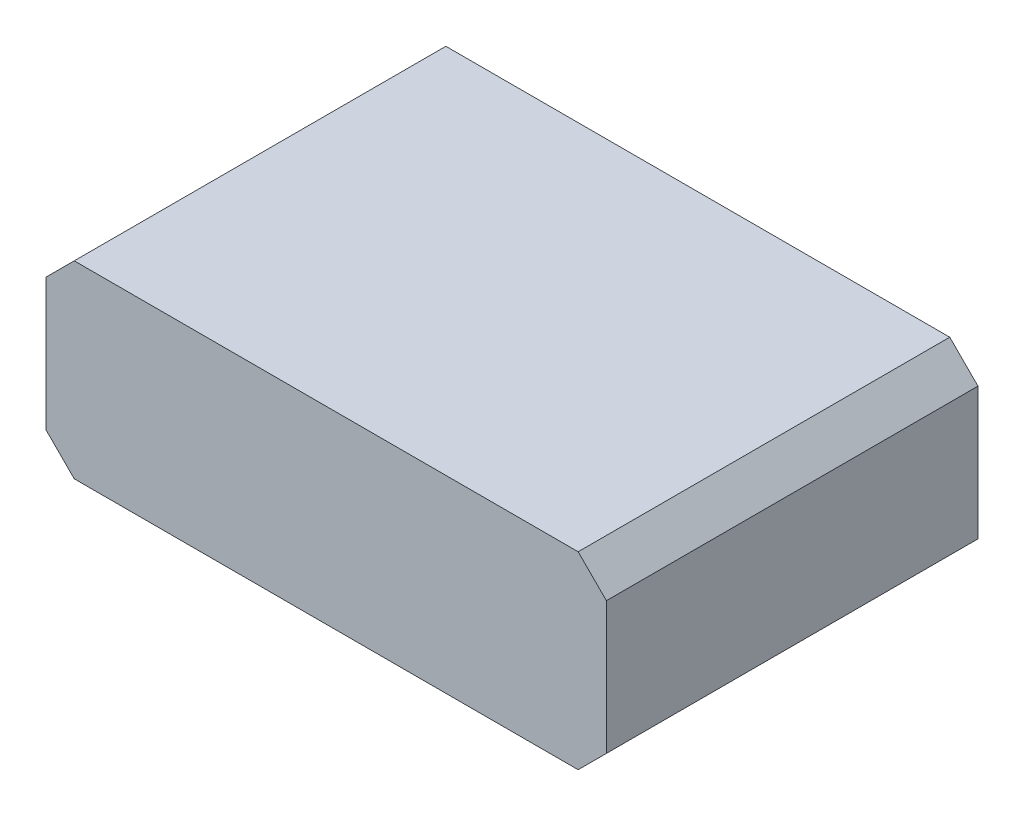
ISO-10303-21;
HEADER;
FILE_DESCRIPTION(('STEP AP214'),'2;1');
FILE_NAME('part.step','',(''),(''),'','','');
FILE_SCHEMA(('AUTOMOTIVE_DESIGN { 1 0 10303 214 1 1 1 1 }'));
ENDSEC;
DATA;
#1=APPLICATION_CONTEXT('core data for automotive mechanical design processes');
#2=APPLICATION_PROTOCOL_DEFINITION('international standard','automotive_design',2000,#1);
#3=PRODUCT_CONTEXT('',#1,'mechanical');
#4=PRODUCT('Part','Part','',(#3));
#5=PRODUCT_RELATED_PRODUCT_CATEGORY('part','',(#4));
#6=PRODUCT_DEFINITION_FORMATION('','',#4);
#7=PRODUCT_DEFINITION_CONTEXT('part definition',#1,'design');
#8=PRODUCT_DEFINITION('design','',#6,#7);
#9=PRODUCT_DEFINITION_SHAPE('','',#8);
#10=(LENGTH_UNIT() NAMED_UNIT(*) SI_UNIT(.MILLI.,.METRE.));
#11=(NAMED_UNIT(*) PLANE_ANGLE_UNIT() SI_UNIT($,.RADIAN.));
#12=(NAMED_UNIT(*) SI_UNIT($,.STERADIAN.) SOLID_ANGLE_UNIT());
#13=UNCERTAINTY_MEASURE_WITH_UNIT(LENGTH_MEASURE(1.E-05),#10,'distance_accuracy_value','');
#14=(GEOMETRIC_REPRESENTATION_CONTEXT(3) GLOBAL_UNCERTAINTY_ASSIGNED_CONTEXT((#13)) GLOBAL_UNIT_ASSIGNED_CONTEXT((#10,
#11,#12)) REPRESENTATION_CONTEXT('',''));
#15=CARTESIAN_POINT('',(0.,0.,0.));
#16=DIRECTION('',(0.,0.,1.));
#17=DIRECTION('',(1.,0.,0.));
#18=AXIS2_PLACEMENT_3D('',#15,#16,#17);
#19=CARTESIAN_POINT('',(0.754000000000032,-0.177999999999999,0.));
#20=DIRECTION('',(1.,0.,0.));
#21=DIRECTION('',(0.,0.,-1.));
#22=AXIS2_PLACEMENT_3D('',#19,#20,#21);
#23=PLANE('',#22);
#24=DIRECTION('',(0.,0.,1.));
#25=VECTOR('',#24,1.);
#26=CARTESIAN_POINT('',(0.754000000000057,-0.178000000000025,0.));
#27=LINE('',#26,#25);
#28=CARTESIAN_POINT('',(0.754000000000045,-0.178000000000012,0.));
#29=VERTEX_POINT('',#28);
#30=CARTESIAN_POINT('',(0.754000000000045,-0.178000000000012,1.00000000000006));
#31=VERTEX_POINT('',#30);
#32=EDGE_CURVE('E84',#29,#31,#27,.T.);
#33=ORIENTED_EDGE('',*,*,#32,.F.);
#34=DIRECTION('',(0.,1.,0.));
#35=VECTOR('',#34,1.);
#36=CARTESIAN_POINT('',(0.754000000000032,0.,0.));
#37=LINE('',#36,#35);
#38=CARTESIAN_POINT('',(0.754000000000032,0.177999999999999,0.));
#39=VERTEX_POINT('',#38);
#40=EDGE_CURVE('E123',#29,#39,#37,.T.);
#41=ORIENTED_EDGE('',*,*,#40,.T.);
#42=DIRECTION('',(0.,0.,1.));
#43=VECTOR('',#42,1.);
#44=CARTESIAN_POINT('',(0.754000000000032,0.177999999999999,0.));
#45=LINE('',#44,#43);
#46=CARTESIAN_POINT('',(0.754000000000032,0.177999999999999,1.00000000000006));
#47=VERTEX_POINT('',#46);
#48=EDGE_CURVE('E20',#47,#39,#45,.F.);
#49=ORIENTED_EDGE('',*,*,#48,.F.);
#50=DIRECTION('',(0.,1.,0.));
#51=VECTOR('',#50,1.);
#52=CARTESIAN_POINT('',(0.754000000000032,0.,1.00000000000006));
#53=LINE('',#52,#51);
#54=EDGE_CURVE('E95',#31,#47,#53,.T.);
#55=ORIENTED_EDGE('',*,*,#54,.F.);
#56=EDGE_LOOP('',(#33,#41,#49,#55));
#57=FACE_BOUND('',#56,.T.);
#58=ADVANCED_FACE('F17',(#57),#23,.T.);
#59=CARTESIAN_POINT('',(0.754000000000032,0.177999999999999,0.));
#60=DIRECTION('',(0.707106781186548,0.707106781186548,0.));
#61=DIRECTION('',(-0.707106781186548,0.707106781186548,0.));
#62=AXIS2_PLACEMENT_3D('',#59,#60,#61);
#63=PLANE('',#62);
#64=ORIENTED_EDGE('',*,*,#48,.T.);
#65=DIRECTION('',(-0.707106781186311,0.707106781186784,0.));
#66=VECTOR('',#65,1.);
#67=CARTESIAN_POINT('',(0.754000000000032,0.177999999999999,0.));
#68=LINE('',#67,#66);
#69=CARTESIAN_POINT('',(0.678000000000069,0.253999999999987,0.));
#70=VERTEX_POINT('',#69);
#71=EDGE_CURVE('E119',#39,#70,#68,.T.);
#72=ORIENTED_EDGE('',*,*,#71,.T.);
#73=DIRECTION('',(0.,0.,1.));
#74=VECTOR('',#73,1.);
#75=CARTESIAN_POINT('',(0.678000000000082,0.254,0.));
#76=LINE('',#75,#74);
#77=CARTESIAN_POINT('',(0.678000000000069,0.253999999999987,1.00000000000006));
#78=VERTEX_POINT('',#77);
#79=EDGE_CURVE('E111',#78,#70,#76,.F.);
#80=ORIENTED_EDGE('',*,*,#79,.F.);
#81=DIRECTION('',(-0.707106781186311,0.707106781186784,0.));
#82=VECTOR('',#81,1.);
#83=CARTESIAN_POINT('',(0.754000000000032,0.177999999999999,1.00000000000006));
#84=LINE('',#83,#82);
#85=EDGE_CURVE('E98',#47,#78,#84,.T.);
#86=ORIENTED_EDGE('',*,*,#85,.F.);
#87=EDGE_LOOP('',(#64,#72,#80,#86));
#88=FACE_BOUND('',#87,.T.);
#89=ADVANCED_FACE('F118',(#88),#63,.T.);
#90=CARTESIAN_POINT('',(0.678000000000082,0.254,0.));
#91=DIRECTION('',(0.,1.,0.));
#92=DIRECTION('',(0.,0.,1.));
#93=AXIS2_PLACEMENT_3D('',#90,#91,#92);
#94=PLANE('',#93);
#95=ORIENTED_EDGE('',*,*,#79,.T.);
#96=DIRECTION('',(1.,0.,0.));
#97=VECTOR('',#96,1.);
#98=CARTESIAN_POINT('',(0.,0.254,0.));
#99=LINE('',#98,#97);
#100=CARTESIAN_POINT('',(-0.678000000000082,0.254,0.));
#101=VERTEX_POINT('',#100);
#102=EDGE_CURVE('E125',#70,#101,#99,.F.);
#103=ORIENTED_EDGE('',*,*,#102,.T.);
#104=DIRECTION('',(0.,0.,1.));
#105=VECTOR('',#104,1.);
#106=CARTESIAN_POINT('',(-0.678000000000082,0.254,0.));
#107=LINE('',#106,#105);
#108=CARTESIAN_POINT('',(-0.678000000000082,0.254,1.00000000000006));
#109=VERTEX_POINT('',#108);
#110=EDGE_CURVE('E109',#109,#101,#107,.F.);
#111=ORIENTED_EDGE('',*,*,#110,.F.);
#112=DIRECTION('',(1.,0.,0.));
#113=VECTOR('',#112,1.);
#114=CARTESIAN_POINT('',(0.,0.254,1.00000000000006));
#115=LINE('',#114,#113);
#116=EDGE_CURVE('E143',#78,#109,#115,.F.);
#117=ORIENTED_EDGE('',*,*,#116,.F.);
#118=EDGE_LOOP('',(#95,#103,#111,#117));
#119=FACE_BOUND('',#118,.T.);
#120=ADVANCED_FACE('F146',(#119),#94,.T.);
#121=CARTESIAN_POINT('',(-0.678000000000082,0.254,0.));
#122=DIRECTION('',(-0.707106781186548,0.707106781186548,0.));
#123=DIRECTION('',(-0.707106781186548,-0.707106781186548,0.));
#124=AXIS2_PLACEMENT_3D('',#121,#122,#123);
#125=PLANE('',#124);
#126=ORIENTED_EDGE('',*,*,#110,.T.);
#127=DIRECTION('',(-0.707106781186311,-0.707106781186784,0.));
#128=VECTOR('',#127,1.);
#129=CARTESIAN_POINT('',(-0.678000000000082,0.254,0.));
#130=LINE('',#129,#128);
#131=CARTESIAN_POINT('',(-0.754000000000045,0.178000000000012,0.));
#132=VERTEX_POINT('',#131);
#133=EDGE_CURVE('E127',#101,#132,#130,.T.);
#134=ORIENTED_EDGE('',*,*,#133,.T.);
#135=DIRECTION('',(0.,0.,1.));
#136=VECTOR('',#135,1.);
#137=CARTESIAN_POINT('',(-0.754000000000032,0.177999999999999,0.));
#138=LINE('',#137,#136);
#139=CARTESIAN_POINT('',(-0.754000000000045,0.178000000000012,1.00000000000006));
#140=VERTEX_POINT('',#139);
#141=EDGE_CURVE('E92',#140,#132,#138,.F.);
#142=ORIENTED_EDGE('',*,*,#141,.F.);
#143=DIRECTION('',(-0.707106781186311,-0.707106781186784,0.));
#144=VECTOR('',#143,1.);
#145=CARTESIAN_POINT('',(-0.678000000000082,0.254,1.00000000000006));
#146=LINE('',#145,#144);
#147=EDGE_CURVE('E140',#109,#140,#146,.T.);
#148=ORIENTED_EDGE('',*,*,#147,.F.);
#149=EDGE_LOOP('',(#126,#134,#142,#148));
#150=FACE_BOUND('',#149,.T.);
#151=ADVANCED_FACE('F148',(#150),#125,.T.);
#152=CARTESIAN_POINT('',(-0.754000000000032,0.177999999999999,0.));
#153=DIRECTION('',(-1.,0.,0.));
#154=DIRECTION('',(0.,0.,1.));
#155=AXIS2_PLACEMENT_3D('',#152,#153,#154);
#156=PLANE('',#155);
#157=ORIENTED_EDGE('',*,*,#141,.T.);
#158=DIRECTION('',(0.,1.,0.));
#159=VECTOR('',#158,1.);
#160=CARTESIAN_POINT('',(-0.754000000000032,0.,0.));
#161=LINE('',#160,#159);
#162=CARTESIAN_POINT('',(-0.754000000000032,-0.177999999999999,0.));
#163=VERTEX_POINT('',#162);
#164=EDGE_CURVE('E163',#132,#163,#161,.F.);
#165=ORIENTED_EDGE('',*,*,#164,.T.);
#166=DIRECTION('',(0.,0.,1.));
#167=VECTOR('',#166,1.);
#168=CARTESIAN_POINT('',(-0.754000000000032,-0.177999999999999,0.));
#169=LINE('',#168,#167);
#170=CARTESIAN_POINT('',(-0.754000000000032,-0.177999999999999,1.00000000000006));
#171=VERTEX_POINT('',#170);
#172=EDGE_CURVE('E133',#171,#163,#169,.F.);
#173=ORIENTED_EDGE('',*,*,#172,.F.);
#174=DIRECTION('',(0.,1.,0.));
#175=VECTOR('',#174,1.);
#176=CARTESIAN_POINT('',(-0.754000000000032,0.,1.00000000000006));
#177=LINE('',#176,#175);
#178=EDGE_CURVE('E138',#140,#171,#177,.F.);
#179=ORIENTED_EDGE('',*,*,#178,.F.);
#180=EDGE_LOOP('',(#157,#165,#173,#179));
#181=FACE_BOUND('',#180,.T.);
#182=ADVANCED_FACE('F152',(#181),#156,.T.);
#183=CARTESIAN_POINT('',(0.678000000000082,-0.254,0.));
#184=DIRECTION('',(0.707106781186548,-0.707106781186548,0.));
#185=DIRECTION('',(0.707106781186548,0.707106781186548,0.));
#186=AXIS2_PLACEMENT_3D('',#183,#184,#185);
#187=PLANE('',#186);
#188=DIRECTION('',(0.,0.,-1.));
#189=VECTOR('',#188,1.);
#190=CARTESIAN_POINT('',(0.678000000000082,-0.254,0.));
#191=LINE('',#190,#189);
#192=CARTESIAN_POINT('',(0.678000000000082,-0.254,0.));
#193=VERTEX_POINT('',#192);
#194=CARTESIAN_POINT('',(0.678000000000082,-0.254,1.00000000000006));
#195=VERTEX_POINT('',#194);
#196=EDGE_CURVE('E158',#193,#195,#191,.F.);
#197=ORIENTED_EDGE('',*,*,#196,.F.);
#198=DIRECTION('',(0.707106781186311,0.707106781186784,0.));
#199=VECTOR('',#198,1.);
#200=CARTESIAN_POINT('',(0.678000000000082,-0.254,0.));
#201=LINE('',#200,#199);
#202=EDGE_CURVE('E90',#193,#29,#201,.T.);
#203=ORIENTED_EDGE('',*,*,#202,.T.);
#204=ORIENTED_EDGE('',*,*,#32,.T.);
#205=DIRECTION('',(0.707106781186311,0.707106781186784,0.));
#206=VECTOR('',#205,1.);
#207=CARTESIAN_POINT('',(0.678000000000082,-0.254,1.00000000000006));
#208=LINE('',#207,#206);
#209=EDGE_CURVE('E87',#195,#31,#208,.T.);
#210=ORIENTED_EDGE('',*,*,#209,.F.);
#211=EDGE_LOOP('',(#197,#203,#204,#210));
#212=FACE_BOUND('',#211,.T.);
#213=ADVANCED_FACE('F85',(#212),#187,.T.);
#214=CARTESIAN_POINT('',(0.,0.,1.00000000000006));
#215=DIRECTION('',(0.,0.,1.));
#216=DIRECTION('',(1.,0.,0.));
#217=AXIS2_PLACEMENT_3D('',#214,#215,#216);
#218=PLANE('',#217);
#219=DIRECTION('',(0.707106781186548,-0.707106781186548,0.));
#220=VECTOR('',#219,1.);
#221=CARTESIAN_POINT('',(-0.754000000000032,-0.177999999999999,1.00000000000006));
#222=LINE('',#221,#220);
#223=CARTESIAN_POINT('',(-0.678000000000076,-0.253999999999994,1.00000000000006));
#224=VERTEX_POINT('',#223);
#225=EDGE_CURVE('E135',#224,#171,#222,.F.);
#226=ORIENTED_EDGE('',*,*,#225,.F.);
#227=DIRECTION('',(1.,0.,0.));
#228=VECTOR('',#227,1.);
#229=CARTESIAN_POINT('',(-0.678000000000082,-0.254,1.00000000000006));
#230=LINE('',#229,#228);
#231=EDGE_CURVE('E102',#195,#224,#230,.F.);
#232=ORIENTED_EDGE('',*,*,#231,.F.);
#233=ORIENTED_EDGE('',*,*,#209,.T.);
#234=ORIENTED_EDGE('',*,*,#54,.T.);
#235=ORIENTED_EDGE('',*,*,#85,.T.);
#236=ORIENTED_EDGE('',*,*,#116,.T.);
#237=ORIENTED_EDGE('',*,*,#147,.T.);
#238=ORIENTED_EDGE('',*,*,#178,.T.);
#239=EDGE_LOOP('',(#226,#232,#233,#234,#235,#236,#237,#238));
#240=FACE_BOUND('',#239,.T.);
#241=ADVANCED_FACE('F100',(#240),#218,.T.);
#242=CARTESIAN_POINT('',(-0.754000000000032,-0.177999999999999,0.));
#243=DIRECTION('',(-0.707106781186548,-0.707106781186548,0.));
#244=DIRECTION('',(0.707106781186548,-0.707106781186548,0.));
#245=AXIS2_PLACEMENT_3D('',#242,#243,#244);
#246=PLANE('',#245);
#247=ORIENTED_EDGE('',*,*,#172,.T.);
#248=DIRECTION('',(0.707106781186311,-0.707106781186784,0.));
#249=VECTOR('',#248,1.);
#250=CARTESIAN_POINT('',(-0.754000000000032,-0.177999999999999,0.));
#251=LINE('',#250,#249);
#252=CARTESIAN_POINT('',(-0.678000000000069,-0.253999999999987,0.));
#253=VERTEX_POINT('',#252);
#254=EDGE_CURVE('E35',#163,#253,#251,.T.);
#255=ORIENTED_EDGE('',*,*,#254,.T.);
#256=DIRECTION('',(0.,0.,-1.));
#257=VECTOR('',#256,1.);
#258=CARTESIAN_POINT('',(-0.678000000000082,-0.254,0.));
#259=LINE('',#258,#257);
#260=EDGE_CURVE('E26',#224,#253,#259,.T.);
#261=ORIENTED_EDGE('',*,*,#260,.F.);
#262=ORIENTED_EDGE('',*,*,#225,.T.);
#263=EDGE_LOOP('',(#247,#255,#261,#262));
#264=FACE_BOUND('',#263,.T.);
#265=ADVANCED_FACE('F154',(#264),#246,.T.);
#266=CARTESIAN_POINT('',(0.,0.,0.));
#267=DIRECTION('',(0.,0.,1.));
#268=DIRECTION('',(1.,0.,0.));
#269=AXIS2_PLACEMENT_3D('',#266,#267,#268);
#270=PLANE('',#269);
#271=ORIENTED_EDGE('',*,*,#164,.F.);
#272=ORIENTED_EDGE('',*,*,#133,.F.);
#273=ORIENTED_EDGE('',*,*,#102,.F.);
#274=ORIENTED_EDGE('',*,*,#71,.F.);
#275=ORIENTED_EDGE('',*,*,#40,.F.);
#276=ORIENTED_EDGE('',*,*,#202,.F.);
#277=DIRECTION('',(1.,0.,0.));
#278=VECTOR('',#277,1.);
#279=CARTESIAN_POINT('',(-0.678000000000082,-0.254,0.));
#280=LINE('',#279,#278);
#281=EDGE_CURVE('E11',#253,#193,#280,.T.);
#282=ORIENTED_EDGE('',*,*,#281,.F.);
#283=ORIENTED_EDGE('',*,*,#254,.F.);
#284=EDGE_LOOP('',(#271,#272,#273,#274,#275,#276,#282,#283));
#285=FACE_BOUND('',#284,.T.);
#286=ADVANCED_FACE('F122',(#285),#270,.F.);
#287=CARTESIAN_POINT('',(-0.678000000000082,-0.254,0.));
#288=DIRECTION('',(0.,-1.,0.));
#289=DIRECTION('',(0.,0.,-1.));
#290=AXIS2_PLACEMENT_3D('',#287,#288,#289);
#291=PLANE('',#290);
#292=ORIENTED_EDGE('',*,*,#260,.T.);
#293=ORIENTED_EDGE('',*,*,#281,.T.);
#294=ORIENTED_EDGE('',*,*,#196,.T.);
#295=ORIENTED_EDGE('',*,*,#231,.T.);
#296=EDGE_LOOP('',(#292,#293,#294,#295));
#297=FACE_BOUND('',#296,.T.);
#298=ADVANCED_FACE('F157',(#297),#291,.T.);
#299=CLOSED_SHELL('',(#58,#89,#120,#151,#182,#213,#241,#265,#286,#298));
#300=MANIFOLD_SOLID_BREP('B1',#299);
#301=ADVANCED_BREP_SHAPE_REPRESENTATION('',(#18,#300),#14);
#302=SHAPE_DEFINITION_REPRESENTATION(#9,#301);
ENDSEC;
END-ISO-10303-21;
